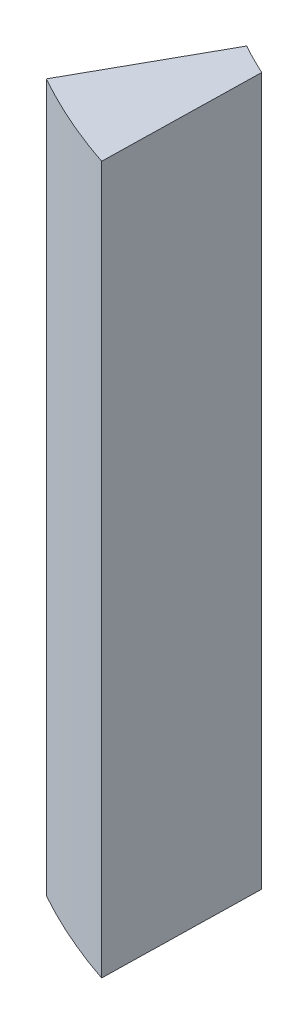
ISO-10303-21;
HEADER;
FILE_DESCRIPTION(('STEP AP214'),'2;1');
FILE_NAME('part.step','',(''),(''),'','','');
FILE_SCHEMA(('AUTOMOTIVE_DESIGN { 1 0 10303 214 1 1 1 1 }'));
ENDSEC;
DATA;
#1=APPLICATION_CONTEXT('core data for automotive mechanical design processes');
#2=APPLICATION_PROTOCOL_DEFINITION('international standard','automotive_design',2000,#1);
#3=PRODUCT_CONTEXT('',#1,'mechanical');
#4=PRODUCT('Part','Part','',(#3));
#5=PRODUCT_RELATED_PRODUCT_CATEGORY('part','',(#4));
#6=PRODUCT_DEFINITION_FORMATION('','',#4);
#7=PRODUCT_DEFINITION_CONTEXT('part definition',#1,'design');
#8=PRODUCT_DEFINITION('design','',#6,#7);
#9=PRODUCT_DEFINITION_SHAPE('','',#8);
#10=(LENGTH_UNIT() NAMED_UNIT(*) SI_UNIT(.MILLI.,.METRE.));
#11=(NAMED_UNIT(*) PLANE_ANGLE_UNIT() SI_UNIT($,.RADIAN.));
#12=(NAMED_UNIT(*) SI_UNIT($,.STERADIAN.) SOLID_ANGLE_UNIT());
#13=UNCERTAINTY_MEASURE_WITH_UNIT(LENGTH_MEASURE(1.E-05),#10,'distance_accuracy_value','');
#14=(GEOMETRIC_REPRESENTATION_CONTEXT(3) GLOBAL_UNCERTAINTY_ASSIGNED_CONTEXT((#13)) GLOBAL_UNIT_ASSIGNED_CONTEXT((#10,
#11,#12)) REPRESENTATION_CONTEXT('',''));
#15=CARTESIAN_POINT('',(0.,0.,0.));
#16=DIRECTION('',(0.,0.,1.));
#17=DIRECTION('',(1.,0.,0.));
#18=AXIS2_PLACEMENT_3D('',#15,#16,#17);
#19=CARTESIAN_POINT('',(-26.7356065438282,48.,-4.61178817597288));
#20=DIRECTION('',(0.,-1.,0.));
#21=DIRECTION('',(0.,0.,-1.));
#22=AXIS2_PLACEMENT_3D('',#19,#20,#21);
#23=CYLINDRICAL_SURFACE('',#22,39.5219719257284);
#24=CARTESIAN_POINT('',(-26.7356065438282,0.,-4.61178817597288));
#25=DIRECTION('',(0.,1.,0.));
#26=DIRECTION('',(0.,0.,1.));
#27=AXIS2_PLACEMENT_3D('',#24,#25,#26);
#28=CIRCLE('',#27,39.5219719257284);
#29=CARTESIAN_POINT('',(-45.9806302478459,0.,29.9079935082999));
#30=VERTEX_POINT('',#29);
#31=CARTESIAN_POINT('',(-39.2601857093275,0.,32.8731578907511));
#32=VERTEX_POINT('',#31);
#33=EDGE_CURVE('E97',#30,#32,#28,.T.);
#34=ORIENTED_EDGE('',*,*,#33,.T.);
#35=DIRECTION('',(0.,-1.,0.));
#36=VECTOR('',#35,1.);
#37=CARTESIAN_POINT('',(-39.2601857093275,48.,32.8731578907511));
#38=LINE('',#37,#36);
#39=CARTESIAN_POINT('',(-39.2601857093275,48.,32.8731578907511));
#40=VERTEX_POINT('',#39);
#41=EDGE_CURVE('E11',#40,#32,#38,.T.);
#42=ORIENTED_EDGE('',*,*,#41,.F.);
#43=CARTESIAN_POINT('',(-26.7356065438282,48.,-4.61178817597288));
#44=DIRECTION('',(0.,1.,0.));
#45=DIRECTION('',(0.,0.,1.));
#46=AXIS2_PLACEMENT_3D('',#43,#44,#45);
#47=CIRCLE('',#46,39.5219719257284);
#48=CARTESIAN_POINT('',(-45.9806302478459,48.,29.9079935082999));
#49=VERTEX_POINT('',#48);
#50=EDGE_CURVE('E85',#49,#40,#47,.T.);
#51=ORIENTED_EDGE('',*,*,#50,.F.);
#52=DIRECTION('',(0.,-1.,0.));
#53=VECTOR('',#52,1.);
#54=CARTESIAN_POINT('',(-45.9806302478459,48.,29.9079935082999));
#55=LINE('',#54,#53);
#56=EDGE_CURVE('E93',#49,#30,#55,.T.);
#57=ORIENTED_EDGE('',*,*,#56,.T.);
#58=EDGE_LOOP('',(#34,#42,#51,#57));
#59=FACE_BOUND('',#58,.T.);
#60=ADVANCED_FACE('F34',(#59),#23,.T.);
#61=CARTESIAN_POINT('',(-39.0461532741293,48.,22.2450601514587));
#62=DIRECTION('',(-0.999797284928962,0.,-0.0201342754693458));
#63=DIRECTION('',(-0.0201342754693458,0.,0.999797284928962));
#64=AXIS2_PLACEMENT_3D('',#61,#62,#63);
#65=PLANE('',#64);
#66=DIRECTION('',(0.0201342754693458,0.,-0.999797284928962));
#67=VECTOR('',#66,1.);
#68=CARTESIAN_POINT('',(-39.0461532741293,0.,22.2450601514587));
#69=LINE('',#68,#67);
#70=CARTESIAN_POINT('',(-39.0456733272392,0.,22.2212276774112));
#71=VERTEX_POINT('',#70);
#72=EDGE_CURVE('E89',#32,#71,#69,.T.);
#73=ORIENTED_EDGE('',*,*,#72,.T.);
#74=DIRECTION('',(0.,-1.,0.));
#75=VECTOR('',#74,1.);
#76=CARTESIAN_POINT('',(-39.0456733272392,48.,22.2212276774112));
#77=LINE('',#76,#75);
#78=CARTESIAN_POINT('',(-39.0456733272392,48.,22.2212276774112));
#79=VERTEX_POINT('',#78);
#80=EDGE_CURVE('E42',#79,#71,#77,.T.);
#81=ORIENTED_EDGE('',*,*,#80,.F.);
#82=DIRECTION('',(0.020134275469333,0.,-0.999797284928962));
#83=VECTOR('',#82,1.);
#84=CARTESIAN_POINT('',(-39.0461532741293,48.,22.2450601514587));
#85=LINE('',#84,#83);
#86=EDGE_CURVE('E80',#40,#79,#85,.T.);
#87=ORIENTED_EDGE('',*,*,#86,.F.);
#88=ORIENTED_EDGE('',*,*,#41,.T.);
#89=EDGE_LOOP('',(#73,#81,#87,#88));
#90=FACE_BOUND('',#89,.T.);
#91=ADVANCED_FACE('F88',(#90),#65,.F.);
#92=CARTESIAN_POINT('',(-26.7356065438282,48.,-4.61178817597288));
#93=DIRECTION('',(0.,-1.,0.));
#94=DIRECTION('',(0.,0.,-1.));
#95=AXIS2_PLACEMENT_3D('',#92,#93,#94);
#96=CYLINDRICAL_SURFACE('',#95,29.522);
#97=CARTESIAN_POINT('',(-26.7356065438282,0.,-4.61178817597288));
#98=DIRECTION('',(0.,-1.,0.));
#99=DIRECTION('',(0.,0.,1.));
#100=AXIS2_PLACEMENT_3D('',#97,#98,#99);
#101=CIRCLE('',#100,29.522);
#102=CARTESIAN_POINT('',(-41.1111946561245,0.,21.1736912732366));
#103=VERTEX_POINT('',#102);
#104=EDGE_CURVE('E67',#71,#103,#101,.T.);
#105=ORIENTED_EDGE('',*,*,#104,.T.);
#106=DIRECTION('',(0.,-1.,0.));
#107=VECTOR('',#106,1.);
#108=CARTESIAN_POINT('',(-41.1111946561245,48.,21.1736912732366));
#109=LINE('',#108,#107);
#110=CARTESIAN_POINT('',(-41.1111946561245,48.,21.1736912732366));
#111=VERTEX_POINT('',#110);
#112=EDGE_CURVE('E90',#111,#103,#109,.T.);
#113=ORIENTED_EDGE('',*,*,#112,.F.);
#114=CARTESIAN_POINT('',(-26.7356065438282,48.,-4.61178817597288));
#115=DIRECTION('',(0.,-1.,0.));
#116=DIRECTION('',(0.,0.,1.));
#117=AXIS2_PLACEMENT_3D('',#114,#115,#116);
#118=CIRCLE('',#117,29.522);
#119=EDGE_CURVE('E83',#79,#111,#118,.T.);
#120=ORIENTED_EDGE('',*,*,#119,.F.);
#121=ORIENTED_EDGE('',*,*,#80,.T.);
#122=EDGE_LOOP('',(#105,#113,#120,#121));
#123=FACE_BOUND('',#122,.T.);
#124=ADVANCED_FACE('F91',(#123),#96,.F.);
#125=CARTESIAN_POINT('',(-41.1111946561245,48.,21.1736912732366));
#126=DIRECTION('',(0.873432675604953,0.,0.486944926234551));
#127=DIRECTION('',(0.486944926234551,0.,-0.873432675604953));
#128=AXIS2_PLACEMENT_3D('',#125,#126,#127);
#129=PLANE('',#128);
#130=DIRECTION('',(-0.486944926234551,0.,0.873432675604953));
#131=VECTOR('',#130,1.);
#132=CARTESIAN_POINT('',(-41.1111946561245,0.,21.1736912732366));
#133=LINE('',#132,#131);
#134=EDGE_CURVE('E73',#103,#30,#133,.T.);
#135=ORIENTED_EDGE('',*,*,#134,.T.);
#136=ORIENTED_EDGE('',*,*,#56,.F.);
#137=DIRECTION('',(-0.486944926234551,0.,0.873432675604953));
#138=VECTOR('',#137,1.);
#139=CARTESIAN_POINT('',(-41.1111946561245,48.,21.1736912732366));
#140=LINE('',#139,#138);
#141=EDGE_CURVE('E50',#111,#49,#140,.T.);
#142=ORIENTED_EDGE('',*,*,#141,.F.);
#143=ORIENTED_EDGE('',*,*,#112,.T.);
#144=EDGE_LOOP('',(#135,#136,#142,#143));
#145=FACE_BOUND('',#144,.T.);
#146=ADVANCED_FACE('F104',(#145),#129,.F.);
#147=CARTESIAN_POINT('',(-26.7356065438282,48.,-4.61178817597288));
#148=DIRECTION('',(0.,1.,0.));
#149=DIRECTION('',(0.,0.,1.));
#150=AXIS2_PLACEMENT_3D('',#147,#148,#149);
#151=PLANE('',#150);
#152=ORIENTED_EDGE('',*,*,#50,.T.);
#153=ORIENTED_EDGE('',*,*,#86,.T.);
#154=ORIENTED_EDGE('',*,*,#119,.T.);
#155=ORIENTED_EDGE('',*,*,#141,.T.);
#156=EDGE_LOOP('',(#152,#153,#154,#155));
#157=FACE_BOUND('',#156,.T.);
#158=ADVANCED_FACE('F81',(#157),#151,.T.);
#159=CARTESIAN_POINT('',(-26.7356065438282,0.,-4.61178817597288));
#160=DIRECTION('',(0.,1.,0.));
#161=DIRECTION('',(0.,0.,1.));
#162=AXIS2_PLACEMENT_3D('',#159,#160,#161);
#163=PLANE('',#162);
#164=ORIENTED_EDGE('',*,*,#33,.F.);
#165=ORIENTED_EDGE('',*,*,#134,.F.);
#166=ORIENTED_EDGE('',*,*,#104,.F.);
#167=ORIENTED_EDGE('',*,*,#72,.F.);
#168=EDGE_LOOP('',(#164,#165,#166,#167));
#169=FACE_BOUND('',#168,.T.);
#170=ADVANCED_FACE('F107',(#169),#163,.F.);
#171=CLOSED_SHELL('',(#60,#91,#124,#146,#158,#170));
#172=MANIFOLD_SOLID_BREP('B2',#171);
#173=ADVANCED_BREP_SHAPE_REPRESENTATION('',(#18,#172),#14);
#174=SHAPE_DEFINITION_REPRESENTATION(#9,#173);
ENDSEC;
END-ISO-10303-21;
